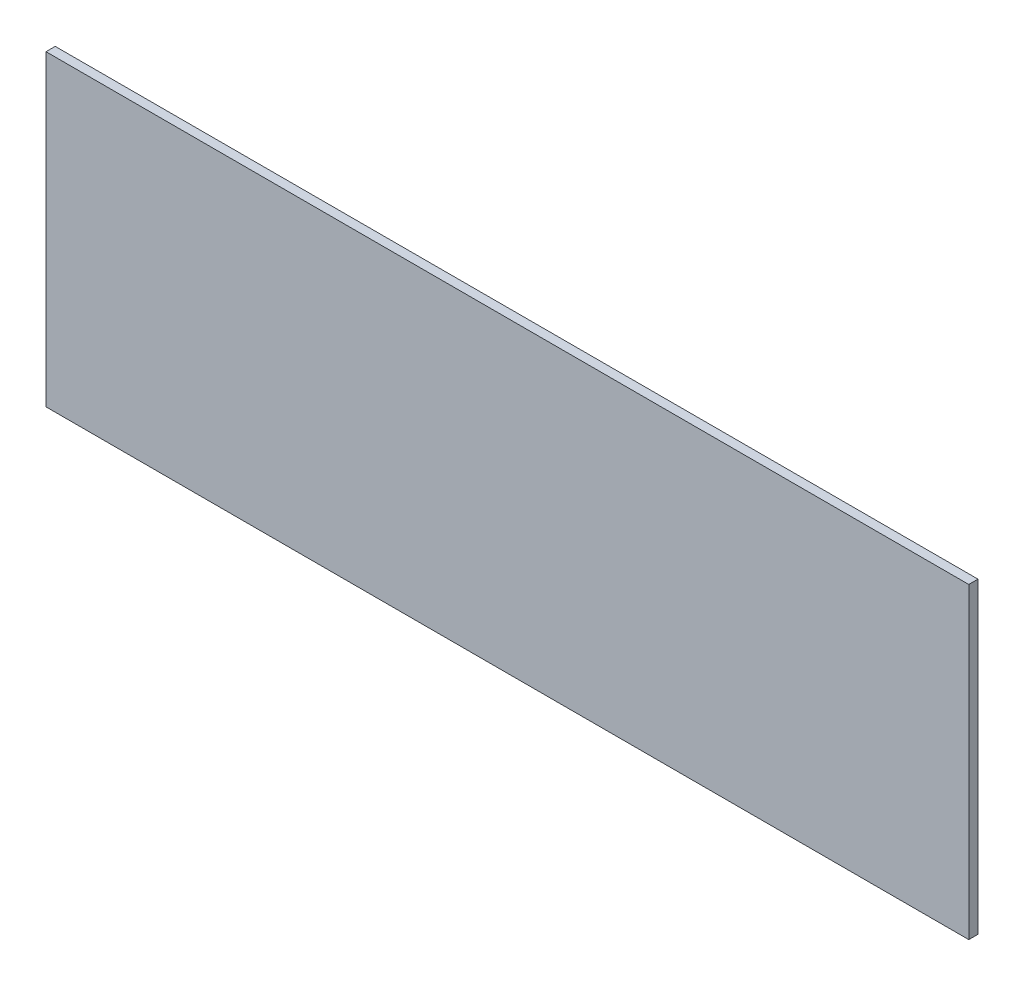
ISO-10303-21;
HEADER;
FILE_DESCRIPTION(('STEP AP214'),'2;1');
FILE_NAME('part.step','',(''),(''),'','','');
FILE_SCHEMA(('AUTOMOTIVE_DESIGN { 1 0 10303 214 1 1 1 1 }'));
ENDSEC;
DATA;
#1=APPLICATION_CONTEXT('core data for automotive mechanical design processes');
#2=APPLICATION_PROTOCOL_DEFINITION('international standard','automotive_design',2000,#1);
#3=PRODUCT_CONTEXT('',#1,'mechanical');
#4=PRODUCT('Part','Part','',(#3));
#5=PRODUCT_RELATED_PRODUCT_CATEGORY('part','',(#4));
#6=PRODUCT_DEFINITION_FORMATION('','',#4);
#7=PRODUCT_DEFINITION_CONTEXT('part definition',#1,'design');
#8=PRODUCT_DEFINITION('design','',#6,#7);
#9=PRODUCT_DEFINITION_SHAPE('','',#8);
#10=(LENGTH_UNIT() NAMED_UNIT(*) SI_UNIT(.MILLI.,.METRE.));
#11=(NAMED_UNIT(*) PLANE_ANGLE_UNIT() SI_UNIT($,.RADIAN.));
#12=(NAMED_UNIT(*) SI_UNIT($,.STERADIAN.) SOLID_ANGLE_UNIT());
#13=UNCERTAINTY_MEASURE_WITH_UNIT(LENGTH_MEASURE(1.E-05),#10,'distance_accuracy_value','');
#14=(GEOMETRIC_REPRESENTATION_CONTEXT(3) GLOBAL_UNCERTAINTY_ASSIGNED_CONTEXT((#13)) GLOBAL_UNIT_ASSIGNED_CONTEXT((#10,
#11,#12)) REPRESENTATION_CONTEXT('',''));
#15=CARTESIAN_POINT('',(0.,0.,0.));
#16=DIRECTION('',(0.,0.,1.));
#17=DIRECTION('',(1.,0.,0.));
#18=AXIS2_PLACEMENT_3D('',#15,#16,#17);
#19=CARTESIAN_POINT('',(0.,0.,1.5));
#20=DIRECTION('',(1.,0.,0.));
#21=DIRECTION('',(0.,0.,-1.));
#22=AXIS2_PLACEMENT_3D('',#19,#20,#21);
#23=PLANE('',#22);
#24=DIRECTION('',(0.,-1.,0.));
#25=VECTOR('',#24,1.);
#26=CARTESIAN_POINT('',(0.,0.,0.));
#27=LINE('',#26,#25);
#28=CARTESIAN_POINT('',(0.,50.,0.));
#29=VERTEX_POINT('',#28);
#30=CARTESIAN_POINT('',(0.,0.,0.));
#31=VERTEX_POINT('',#30);
#32=EDGE_CURVE('E97',#29,#31,#27,.T.);
#33=ORIENTED_EDGE('',*,*,#32,.T.);
#34=DIRECTION('',(0.,0.,-1.));
#35=VECTOR('',#34,1.);
#36=CARTESIAN_POINT('',(0.,0.,1.5));
#37=LINE('',#36,#35);
#38=CARTESIAN_POINT('',(0.,0.,1.5));
#39=VERTEX_POINT('',#38);
#40=EDGE_CURVE('E11',#39,#31,#37,.T.);
#41=ORIENTED_EDGE('',*,*,#40,.F.);
#42=DIRECTION('',(0.,-1.,0.));
#43=VECTOR('',#42,1.);
#44=CARTESIAN_POINT('',(0.,0.,1.5));
#45=LINE('',#44,#43);
#46=CARTESIAN_POINT('',(0.,50.,1.5));
#47=VERTEX_POINT('',#46);
#48=EDGE_CURVE('E85',#47,#39,#45,.T.);
#49=ORIENTED_EDGE('',*,*,#48,.F.);
#50=DIRECTION('',(0.,0.,-1.));
#51=VECTOR('',#50,1.);
#52=CARTESIAN_POINT('',(0.,50.,1.5));
#53=LINE('',#52,#51);
#54=EDGE_CURVE('E93',#47,#29,#53,.T.);
#55=ORIENTED_EDGE('',*,*,#54,.T.);
#56=EDGE_LOOP('',(#33,#41,#49,#55));
#57=FACE_BOUND('',#56,.T.);
#58=ADVANCED_FACE('F34',(#57),#23,.F.);
#59=CARTESIAN_POINT('',(0.,0.,1.5));
#60=DIRECTION('',(0.,1.,0.));
#61=DIRECTION('',(0.,0.,1.));
#62=AXIS2_PLACEMENT_3D('',#59,#60,#61);
#63=PLANE('',#62);
#64=DIRECTION('',(1.,0.,0.));
#65=VECTOR('',#64,1.);
#66=CARTESIAN_POINT('',(0.,0.,0.));
#67=LINE('',#66,#65);
#68=CARTESIAN_POINT('',(150.,0.,0.));
#69=VERTEX_POINT('',#68);
#70=EDGE_CURVE('E89',#31,#69,#67,.T.);
#71=ORIENTED_EDGE('',*,*,#70,.T.);
#72=DIRECTION('',(0.,0.,-1.));
#73=VECTOR('',#72,1.);
#74=CARTESIAN_POINT('',(150.,0.,1.5));
#75=LINE('',#74,#73);
#76=CARTESIAN_POINT('',(150.,0.,1.5));
#77=VERTEX_POINT('',#76);
#78=EDGE_CURVE('E42',#77,#69,#75,.T.);
#79=ORIENTED_EDGE('',*,*,#78,.F.);
#80=DIRECTION('',(1.,0.,0.));
#81=VECTOR('',#80,1.);
#82=CARTESIAN_POINT('',(0.,0.,1.5));
#83=LINE('',#82,#81);
#84=EDGE_CURVE('E80',#39,#77,#83,.T.);
#85=ORIENTED_EDGE('',*,*,#84,.F.);
#86=ORIENTED_EDGE('',*,*,#40,.T.);
#87=EDGE_LOOP('',(#71,#79,#85,#86));
#88=FACE_BOUND('',#87,.T.);
#89=ADVANCED_FACE('F88',(#88),#63,.F.);
#90=CARTESIAN_POINT('',(150.,0.,1.5));
#91=DIRECTION('',(-1.,0.,0.));
#92=DIRECTION('',(0.,0.,1.));
#93=AXIS2_PLACEMENT_3D('',#90,#91,#92);
#94=PLANE('',#93);
#95=DIRECTION('',(0.,1.,0.));
#96=VECTOR('',#95,1.);
#97=CARTESIAN_POINT('',(150.,0.,0.));
#98=LINE('',#97,#96);
#99=CARTESIAN_POINT('',(150.,50.,0.));
#100=VERTEX_POINT('',#99);
#101=EDGE_CURVE('E67',#69,#100,#98,.T.);
#102=ORIENTED_EDGE('',*,*,#101,.T.);
#103=DIRECTION('',(0.,0.,-1.));
#104=VECTOR('',#103,1.);
#105=CARTESIAN_POINT('',(150.,50.,1.5));
#106=LINE('',#105,#104);
#107=CARTESIAN_POINT('',(150.,50.,1.5));
#108=VERTEX_POINT('',#107);
#109=EDGE_CURVE('E90',#108,#100,#106,.T.);
#110=ORIENTED_EDGE('',*,*,#109,.F.);
#111=DIRECTION('',(0.,1.,0.));
#112=VECTOR('',#111,1.);
#113=CARTESIAN_POINT('',(150.,0.,1.5));
#114=LINE('',#113,#112);
#115=EDGE_CURVE('E83',#77,#108,#114,.T.);
#116=ORIENTED_EDGE('',*,*,#115,.F.);
#117=ORIENTED_EDGE('',*,*,#78,.T.);
#118=EDGE_LOOP('',(#102,#110,#116,#117));
#119=FACE_BOUND('',#118,.T.);
#120=ADVANCED_FACE('F91',(#119),#94,.F.);
#121=CARTESIAN_POINT('',(0.,50.,1.5));
#122=DIRECTION('',(0.,-1.,0.));
#123=DIRECTION('',(0.,0.,-1.));
#124=AXIS2_PLACEMENT_3D('',#121,#122,#123);
#125=PLANE('',#124);
#126=DIRECTION('',(-1.,0.,0.));
#127=VECTOR('',#126,1.);
#128=CARTESIAN_POINT('',(0.,50.,0.));
#129=LINE('',#128,#127);
#130=EDGE_CURVE('E73',#100,#29,#129,.T.);
#131=ORIENTED_EDGE('',*,*,#130,.T.);
#132=ORIENTED_EDGE('',*,*,#54,.F.);
#133=DIRECTION('',(-1.,0.,0.));
#134=VECTOR('',#133,1.);
#135=CARTESIAN_POINT('',(0.,50.,1.5));
#136=LINE('',#135,#134);
#137=EDGE_CURVE('E50',#108,#47,#136,.T.);
#138=ORIENTED_EDGE('',*,*,#137,.F.);
#139=ORIENTED_EDGE('',*,*,#109,.T.);
#140=EDGE_LOOP('',(#131,#132,#138,#139));
#141=FACE_BOUND('',#140,.T.);
#142=ADVANCED_FACE('F104',(#141),#125,.F.);
#143=CARTESIAN_POINT('',(0.,0.,1.5));
#144=DIRECTION('',(0.,0.,-1.));
#145=DIRECTION('',(-1.,0.,0.));
#146=AXIS2_PLACEMENT_3D('',#143,#144,#145);
#147=PLANE('',#146);
#148=ORIENTED_EDGE('',*,*,#48,.T.);
#149=ORIENTED_EDGE('',*,*,#84,.T.);
#150=ORIENTED_EDGE('',*,*,#115,.T.);
#151=ORIENTED_EDGE('',*,*,#137,.T.);
#152=EDGE_LOOP('',(#148,#149,#150,#151));
#153=FACE_BOUND('',#152,.T.);
#154=ADVANCED_FACE('F81',(#153),#147,.F.);
#155=CARTESIAN_POINT('',(0.,0.,0.));
#156=DIRECTION('',(0.,0.,-1.));
#157=DIRECTION('',(-1.,0.,0.));
#158=AXIS2_PLACEMENT_3D('',#155,#156,#157);
#159=PLANE('',#158);
#160=ORIENTED_EDGE('',*,*,#32,.F.);
#161=ORIENTED_EDGE('',*,*,#130,.F.);
#162=ORIENTED_EDGE('',*,*,#101,.F.);
#163=ORIENTED_EDGE('',*,*,#70,.F.);
#164=EDGE_LOOP('',(#160,#161,#162,#163));
#165=FACE_BOUND('',#164,.T.);
#166=ADVANCED_FACE('F107',(#165),#159,.T.);
#167=CLOSED_SHELL('',(#58,#89,#120,#142,#154,#166));
#168=MANIFOLD_SOLID_BREP('B2',#167);
#169=ADVANCED_BREP_SHAPE_REPRESENTATION('',(#18,#168),#14);
#170=SHAPE_DEFINITION_REPRESENTATION(#9,#169);
ENDSEC;
END-ISO-10303-21;
